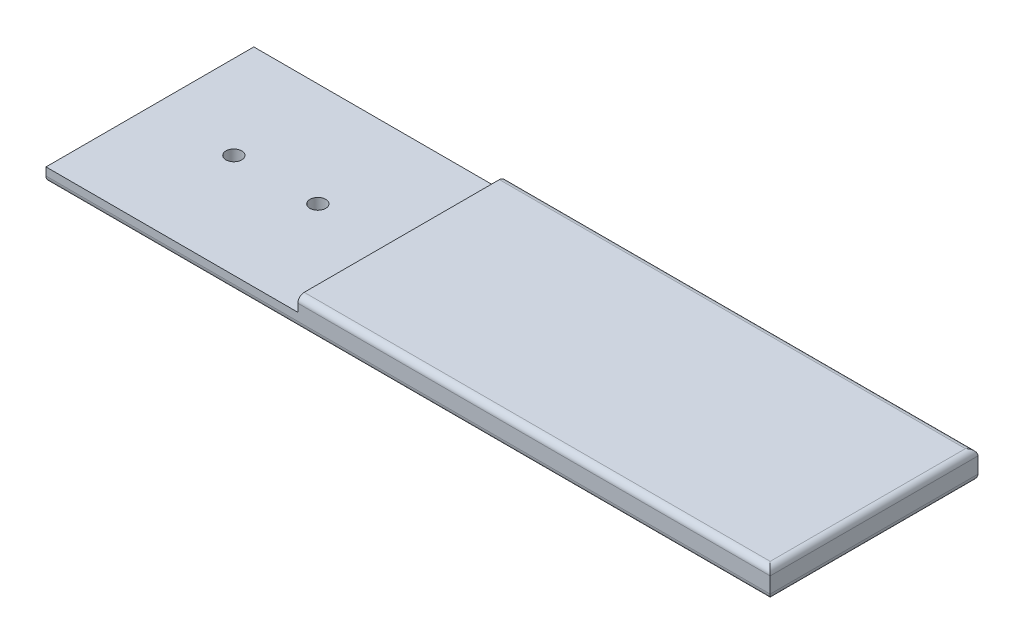
ISO-10303-21;
HEADER;
FILE_DESCRIPTION(('STEP AP214'),'2;1');
FILE_NAME('part.step','',(''),(''),'','','');
FILE_SCHEMA(('AUTOMOTIVE_DESIGN { 1 0 10303 214 1 1 1 1 }'));
ENDSEC;
DATA;
#1=APPLICATION_CONTEXT('core data for automotive mechanical design processes');
#2=APPLICATION_PROTOCOL_DEFINITION('international standard','automotive_design',2000,#1);
#3=PRODUCT_CONTEXT('',#1,'mechanical');
#4=PRODUCT('Part','Part','',(#3));
#5=PRODUCT_RELATED_PRODUCT_CATEGORY('part','',(#4));
#6=PRODUCT_DEFINITION_FORMATION('','',#4);
#7=PRODUCT_DEFINITION_CONTEXT('part definition',#1,'design');
#8=PRODUCT_DEFINITION('design','',#6,#7);
#9=PRODUCT_DEFINITION_SHAPE('','',#8);
#10=(LENGTH_UNIT() NAMED_UNIT(*) SI_UNIT(.MILLI.,.METRE.));
#11=(NAMED_UNIT(*) PLANE_ANGLE_UNIT() SI_UNIT($,.RADIAN.));
#12=(NAMED_UNIT(*) SI_UNIT($,.STERADIAN.) SOLID_ANGLE_UNIT());
#13=UNCERTAINTY_MEASURE_WITH_UNIT(LENGTH_MEASURE(1.E-05),#10,'distance_accuracy_value','');
#14=(GEOMETRIC_REPRESENTATION_CONTEXT(3) GLOBAL_UNCERTAINTY_ASSIGNED_CONTEXT((#13)) GLOBAL_UNIT_ASSIGNED_CONTEXT((#10,
#11,#12)) REPRESENTATION_CONTEXT('',''));
#15=CARTESIAN_POINT('',(0.,0.,0.));
#16=DIRECTION('',(0.,0.,1.));
#17=DIRECTION('',(1.,0.,0.));
#18=AXIS2_PLACEMENT_3D('',#15,#16,#17);
#19=CARTESIAN_POINT('',(0.,4.5,0.));
#20=DIRECTION('',(0.,-1.,0.));
#21=DIRECTION('',(0.,0.,-1.));
#22=AXIS2_PLACEMENT_3D('',#19,#20,#21);
#23=PLANE('',#22);
#24=CARTESIAN_POINT('',(-5.9231950844854,4.5,-12.4516129032258));
#25=DIRECTION('',(0.,-1.,0.));
#26=DIRECTION('',(0.,0.,-1.));
#27=AXIS2_PLACEMENT_3D('',#24,#25,#26);
#28=CIRCLE('',#27,2.5);
#29=CARTESIAN_POINT('',(-5.9231950844854,4.5,-14.9516129032258));
#30=VERTEX_POINT('',#29);
#31=EDGE_CURVE('E427',#30,#30,#28,.T.);
#32=ORIENTED_EDGE('',*,*,#31,.T.);
#33=EDGE_LOOP('',(#32));
#34=FACE_BOUND('',#33,.T.);
#35=CARTESIAN_POINT('',(20.7434715821813,4.5,-12.4516129032258));
#36=DIRECTION('',(0.,-1.,0.));
#37=DIRECTION('',(0.,0.,-1.));
#38=AXIS2_PLACEMENT_3D('',#35,#36,#37);
#39=CIRCLE('',#38,2.5);
#40=CARTESIAN_POINT('',(20.7434715821813,4.5,-14.9516129032258));
#41=VERTEX_POINT('',#40);
#42=EDGE_CURVE('E139',#41,#41,#39,.T.);
#43=ORIENTED_EDGE('',*,*,#42,.T.);
#44=EDGE_LOOP('',(#43));
#45=FACE_BOUND('',#44,.T.);
#46=DIRECTION('',(0.,0.,1.));
#47=VECTOR('',#46,1.);
#48=CARTESIAN_POINT('',(47.4101382488479,4.5,0.));
#49=LINE('',#48,#47);
#50=CARTESIAN_POINT('',(47.4101382488479,4.5,-45.4516129032258));
#51=VERTEX_POINT('',#50);
#52=CARTESIAN_POINT('',(47.4101382488479,4.5,20.5483870967742));
#53=VERTEX_POINT('',#52);
#54=EDGE_CURVE('E130',#51,#53,#49,.T.);
#55=ORIENTED_EDGE('',*,*,#54,.F.);
#56=DIRECTION('',(-1.,0.,0.));
#57=VECTOR('',#56,1.);
#58=CARTESIAN_POINT('',(-32.5898617511521,4.5,-45.4516129032258));
#59=LINE('',#58,#57);
#60=CARTESIAN_POINT('',(-32.5898617511521,4.5,-45.4516129032258));
#61=VERTEX_POINT('',#60);
#62=EDGE_CURVE('E135',#51,#61,#59,.T.);
#63=ORIENTED_EDGE('',*,*,#62,.T.);
#64=DIRECTION('',(0.,0.,1.));
#65=VECTOR('',#64,1.);
#66=CARTESIAN_POINT('',(-32.5898617511521,4.5,20.5483870967742));
#67=LINE('',#66,#65);
#68=CARTESIAN_POINT('',(-32.5898617511521,4.5,20.5483870967742));
#69=VERTEX_POINT('',#68);
#70=EDGE_CURVE('E133',#61,#69,#67,.T.);
#71=ORIENTED_EDGE('',*,*,#70,.T.);
#72=DIRECTION('',(1.,0.,0.));
#73=VECTOR('',#72,1.);
#74=CARTESIAN_POINT('',(-32.5898617511521,4.5,20.5483870967742));
#75=LINE('',#74,#73);
#76=EDGE_CURVE('E118',#69,#53,#75,.T.);
#77=ORIENTED_EDGE('',*,*,#76,.T.);
#78=EDGE_LOOP('',(#55,#63,#71,#77));
#79=FACE_BOUND('',#78,.T.);
#80=ADVANCED_FACE('F38',(#34,#45,#79),#23,.F.);
#81=CARTESIAN_POINT('',(-32.5898617511521,4.5,20.5483870967742));
#82=DIRECTION('',(1.,0.,0.));
#83=DIRECTION('',(0.,0.,-1.));
#84=AXIS2_PLACEMENT_3D('',#81,#82,#83);
#85=PLANE('',#84);
#86=DIRECTION('',(0.,-1.,0.));
#87=VECTOR('',#86,1.);
#88=CARTESIAN_POINT('',(-32.5898617511521,4.5,-45.4516129032258));
#89=LINE('',#88,#87);
#90=CARTESIAN_POINT('',(-32.5898617511521,2.,-45.4516129032258));
#91=VERTEX_POINT('',#90);
#92=EDGE_CURVE('E152',#61,#91,#89,.T.);
#93=ORIENTED_EDGE('',*,*,#92,.T.);
#94=CARTESIAN_POINT('',(-32.5898617511521,2.,-43.4516129032258));
#95=DIRECTION('',(1.,0.,0.));
#96=DIRECTION('',(0.,0.,-1.));
#97=AXIS2_PLACEMENT_3D('',#94,#95,#96);
#98=CIRCLE('',#97,2.);
#99=CARTESIAN_POINT('',(-32.5898617511521,0.,-43.4516129032258));
#100=VERTEX_POINT('',#99);
#101=EDGE_CURVE('E190',#91,#100,#98,.F.);
#102=ORIENTED_EDGE('',*,*,#101,.T.);
#103=DIRECTION('',(0.,0.,1.));
#104=VECTOR('',#103,1.);
#105=CARTESIAN_POINT('',(-32.5898617511521,0.,20.5483870967742));
#106=LINE('',#105,#104);
#107=CARTESIAN_POINT('',(-32.5898617511521,0.,18.5483870967742));
#108=VERTEX_POINT('',#107);
#109=EDGE_CURVE('E149',#100,#108,#106,.T.);
#110=ORIENTED_EDGE('',*,*,#109,.T.);
#111=CARTESIAN_POINT('',(-32.5898617511521,2.,18.5483870967742));
#112=DIRECTION('',(1.,0.,0.));
#113=DIRECTION('',(0.,0.,-1.));
#114=AXIS2_PLACEMENT_3D('',#111,#112,#113);
#115=CIRCLE('',#114,2.);
#116=CARTESIAN_POINT('',(-32.5898617511521,2.,20.5483870967742));
#117=VERTEX_POINT('',#116);
#118=EDGE_CURVE('E188',#108,#117,#115,.F.);
#119=ORIENTED_EDGE('',*,*,#118,.T.);
#120=DIRECTION('',(0.,-1.,0.));
#121=VECTOR('',#120,1.);
#122=CARTESIAN_POINT('',(-32.5898617511521,4.5,20.5483870967742));
#123=LINE('',#122,#121);
#124=EDGE_CURVE('E163',#69,#117,#123,.T.);
#125=ORIENTED_EDGE('',*,*,#124,.F.);
#126=ORIENTED_EDGE('',*,*,#70,.F.);
#127=EDGE_LOOP('',(#93,#102,#110,#119,#125,#126));
#128=FACE_BOUND('',#127,.T.);
#129=ADVANCED_FACE('F215',(#128),#85,.F.);
#130=CARTESIAN_POINT('',(-32.5898617511521,4.5,20.5483870967742));
#131=DIRECTION('',(0.,0.,-1.));
#132=DIRECTION('',(-1.,0.,0.));
#133=AXIS2_PLACEMENT_3D('',#130,#131,#132);
#134=PLANE('',#133);
#135=DIRECTION('',(0.,-1.,0.));
#136=VECTOR('',#135,1.);
#137=CARTESIAN_POINT('',(197.410138248848,4.5,20.5483870967742));
#138=LINE('',#137,#136);
#139=CARTESIAN_POINT('',(197.410138248848,7.,20.5483870967742));
#140=VERTEX_POINT('',#139);
#141=CARTESIAN_POINT('',(197.410138248848,2.,20.5483870967742));
#142=VERTEX_POINT('',#141);
#143=EDGE_CURVE('E160',#140,#142,#138,.T.);
#144=ORIENTED_EDGE('',*,*,#143,.F.);
#145=DIRECTION('',(1.,0.,0.));
#146=VECTOR('',#145,1.);
#147=CARTESIAN_POINT('',(47.4101382488479,7.,20.5483870967742));
#148=LINE('',#147,#146);
#149=CARTESIAN_POINT('',(47.4101382488479,7.,20.5483870967742));
#150=VERTEX_POINT('',#149);
#151=EDGE_CURVE('E121',#140,#150,#148,.F.);
#152=ORIENTED_EDGE('',*,*,#151,.T.);
#153=DIRECTION('',(0.,-1.,0.));
#154=VECTOR('',#153,1.);
#155=CARTESIAN_POINT('',(47.4101382488479,9.,20.5483870967742));
#156=LINE('',#155,#154);
#157=EDGE_CURVE('E113',#150,#53,#156,.T.);
#158=ORIENTED_EDGE('',*,*,#157,.T.);
#159=ORIENTED_EDGE('',*,*,#76,.F.);
#160=ORIENTED_EDGE('',*,*,#124,.T.);
#161=DIRECTION('',(1.,0.,0.));
#162=VECTOR('',#161,1.);
#163=CARTESIAN_POINT('',(197.410138248848,2.,20.5483870967742));
#164=LINE('',#163,#162);
#165=EDGE_CURVE('E172',#117,#142,#164,.T.);
#166=ORIENTED_EDGE('',*,*,#165,.T.);
#167=EDGE_LOOP('',(#144,#152,#158,#159,#160,#166));
#168=FACE_BOUND('',#167,.T.);
#169=ADVANCED_FACE('F116',(#168),#134,.F.);
#170=CARTESIAN_POINT('',(197.410138248848,4.5,20.5483870967742));
#171=DIRECTION('',(-1.,0.,0.));
#172=DIRECTION('',(0.,0.,1.));
#173=AXIS2_PLACEMENT_3D('',#170,#171,#172);
#174=PLANE('',#173);
#175=DIRECTION('',(0.,-1.,0.));
#176=VECTOR('',#175,1.);
#177=CARTESIAN_POINT('',(197.410138248848,4.5,-45.4516129032258));
#178=LINE('',#177,#176);
#179=CARTESIAN_POINT('',(197.410138248848,7.,-45.4516129032258));
#180=VERTEX_POINT('',#179);
#181=CARTESIAN_POINT('',(197.410138248848,2.,-45.4516129032258));
#182=VERTEX_POINT('',#181);
#183=EDGE_CURVE('E157',#180,#182,#178,.T.);
#184=ORIENTED_EDGE('',*,*,#183,.F.);
#185=DIRECTION('',(0.,0.,-1.));
#186=VECTOR('',#185,1.);
#187=CARTESIAN_POINT('',(197.410138248848,7.,20.5483870967742));
#188=LINE('',#187,#186);
#189=EDGE_CURVE('E181',#180,#140,#188,.F.);
#190=ORIENTED_EDGE('',*,*,#189,.T.);
#191=ORIENTED_EDGE('',*,*,#143,.T.);
#192=DIRECTION('',(0.,0.,-1.));
#193=VECTOR('',#192,1.);
#194=CARTESIAN_POINT('',(197.410138248848,2.,-45.4516129032258));
#195=LINE('',#194,#193);
#196=EDGE_CURVE('E179',#142,#182,#195,.T.);
#197=ORIENTED_EDGE('',*,*,#196,.T.);
#198=EDGE_LOOP('',(#184,#190,#191,#197));
#199=FACE_BOUND('',#198,.T.);
#200=ADVANCED_FACE('F224',(#199),#174,.F.);
#201=CARTESIAN_POINT('',(-32.5898617511521,4.5,-45.4516129032258));
#202=DIRECTION('',(0.,0.,1.));
#203=DIRECTION('',(1.,0.,0.));
#204=AXIS2_PLACEMENT_3D('',#201,#202,#203);
#205=PLANE('',#204);
#206=DIRECTION('',(0.,-1.,0.));
#207=VECTOR('',#206,1.);
#208=CARTESIAN_POINT('',(47.4101382488479,9.,-45.4516129032258));
#209=LINE('',#208,#207);
#210=CARTESIAN_POINT('',(47.4101382488479,7.,-45.4516129032258));
#211=VERTEX_POINT('',#210);
#212=EDGE_CURVE('E125',#211,#51,#209,.T.);
#213=ORIENTED_EDGE('',*,*,#212,.F.);
#214=DIRECTION('',(-1.,0.,0.));
#215=VECTOR('',#214,1.);
#216=CARTESIAN_POINT('',(197.410138248848,7.,-45.4516129032258));
#217=LINE('',#216,#215);
#218=EDGE_CURVE('E186',#211,#180,#217,.F.);
#219=ORIENTED_EDGE('',*,*,#218,.T.);
#220=ORIENTED_EDGE('',*,*,#183,.T.);
#221=DIRECTION('',(-1.,0.,0.));
#222=VECTOR('',#221,1.);
#223=CARTESIAN_POINT('',(-32.5898617511521,2.,-45.4516129032258));
#224=LINE('',#223,#222);
#225=EDGE_CURVE('E183',#182,#91,#224,.T.);
#226=ORIENTED_EDGE('',*,*,#225,.T.);
#227=ORIENTED_EDGE('',*,*,#92,.F.);
#228=ORIENTED_EDGE('',*,*,#62,.F.);
#229=EDGE_LOOP('',(#213,#219,#220,#226,#227,#228));
#230=FACE_BOUND('',#229,.T.);
#231=ADVANCED_FACE('F219',(#230),#205,.F.);
#232=CARTESIAN_POINT('',(0.,0.,0.));
#233=DIRECTION('',(0.,-1.,0.));
#234=DIRECTION('',(0.,0.,-1.));
#235=AXIS2_PLACEMENT_3D('',#232,#233,#234);
#236=PLANE('',#235);
#237=ORIENTED_EDGE('',*,*,#109,.F.);
#238=DIRECTION('',(-1.,0.,0.));
#239=VECTOR('',#238,1.);
#240=CARTESIAN_POINT('',(197.410138248848,0.,-43.4516129032258));
#241=LINE('',#240,#239);
#242=CARTESIAN_POINT('',(195.410138248848,0.,-43.4516129032258));
#243=VERTEX_POINT('',#242);
#244=EDGE_CURVE('E11',#100,#243,#241,.F.);
#245=ORIENTED_EDGE('',*,*,#244,.T.);
#246=DIRECTION('',(0.,0.,-1.));
#247=VECTOR('',#246,1.);
#248=CARTESIAN_POINT('',(195.410138248848,0.,20.5483870967742));
#249=LINE('',#248,#247);
#250=CARTESIAN_POINT('',(195.410138248848,0.,18.5483870967742));
#251=VERTEX_POINT('',#250);
#252=EDGE_CURVE('E54',#243,#251,#249,.F.);
#253=ORIENTED_EDGE('',*,*,#252,.T.);
#254=DIRECTION('',(1.,0.,0.));
#255=VECTOR('',#254,1.);
#256=CARTESIAN_POINT('',(-32.5898617511521,0.,18.5483870967742));
#257=LINE('',#256,#255);
#258=EDGE_CURVE('E47',#251,#108,#257,.F.);
#259=ORIENTED_EDGE('',*,*,#258,.T.);
#260=EDGE_LOOP('',(#237,#245,#253,#259));
#261=FACE_BOUND('',#260,.T.);
#262=CARTESIAN_POINT('',(-5.9231950844854,0.,-12.4516129032258));
#263=DIRECTION('',(0.,-1.,0.));
#264=DIRECTION('',(0.,0.,-1.));
#265=AXIS2_PLACEMENT_3D('',#262,#263,#264);
#266=CIRCLE('',#265,2.5);
#267=CARTESIAN_POINT('',(-5.9231950844854,0.,-14.9516129032258));
#268=VERTEX_POINT('',#267);
#269=EDGE_CURVE('E198',#268,#268,#266,.T.);
#270=ORIENTED_EDGE('',*,*,#269,.F.);
#271=EDGE_LOOP('',(#270));
#272=FACE_BOUND('',#271,.T.);
#273=CARTESIAN_POINT('',(20.7434715821813,0.,-12.4516129032258));
#274=DIRECTION('',(0.,-1.,0.));
#275=DIRECTION('',(0.,0.,-1.));
#276=AXIS2_PLACEMENT_3D('',#273,#274,#275);
#277=CIRCLE('',#276,2.5);
#278=CARTESIAN_POINT('',(20.7434715821813,0.,-14.9516129032258));
#279=VERTEX_POINT('',#278);
#280=EDGE_CURVE('E144',#279,#279,#277,.T.);
#281=ORIENTED_EDGE('',*,*,#280,.F.);
#282=EDGE_LOOP('',(#281));
#283=FACE_BOUND('',#282,.T.);
#284=ADVANCED_FACE('F212',(#261,#272,#283),#236,.T.);
#285=CARTESIAN_POINT('',(47.4101382488479,9.,0.));
#286=DIRECTION('',(1.,0.,0.));
#287=DIRECTION('',(0.,0.,-1.));
#288=AXIS2_PLACEMENT_3D('',#285,#286,#287);
#289=PLANE('',#288);
#290=ORIENTED_EDGE('',*,*,#157,.F.);
#291=CARTESIAN_POINT('',(47.4101382488479,7.,18.5483870967742));
#292=DIRECTION('',(1.,0.,0.));
#293=DIRECTION('',(0.,0.,-1.));
#294=AXIS2_PLACEMENT_3D('',#291,#292,#293);
#295=CIRCLE('',#294,2.);
#296=CARTESIAN_POINT('',(47.4101382488479,9.,18.5483870967742));
#297=VERTEX_POINT('',#296);
#298=EDGE_CURVE('E177',#150,#297,#295,.F.);
#299=ORIENTED_EDGE('',*,*,#298,.T.);
#300=DIRECTION('',(0.,0.,1.));
#301=VECTOR('',#300,1.);
#302=CARTESIAN_POINT('',(47.4101382488479,9.,0.));
#303=LINE('',#302,#301);
#304=CARTESIAN_POINT('',(47.4101382488479,9.,-43.4516129032258));
#305=VERTEX_POINT('',#304);
#306=EDGE_CURVE('E126',#305,#297,#303,.T.);
#307=ORIENTED_EDGE('',*,*,#306,.F.);
#308=CARTESIAN_POINT('',(47.4101382488479,7.,-43.4516129032258));
#309=DIRECTION('',(1.,0.,0.));
#310=DIRECTION('',(0.,0.,-1.));
#311=AXIS2_PLACEMENT_3D('',#308,#309,#310);
#312=CIRCLE('',#311,2.);
#313=EDGE_CURVE('E175',#305,#211,#312,.F.);
#314=ORIENTED_EDGE('',*,*,#313,.T.);
#315=ORIENTED_EDGE('',*,*,#212,.T.);
#316=ORIENTED_EDGE('',*,*,#54,.T.);
#317=EDGE_LOOP('',(#290,#299,#307,#314,#315,#316));
#318=FACE_BOUND('',#317,.T.);
#319=ADVANCED_FACE('F137',(#318),#289,.F.);
#320=CARTESIAN_POINT('',(0.,9.,0.));
#321=DIRECTION('',(0.,1.,0.));
#322=DIRECTION('',(0.,0.,1.));
#323=AXIS2_PLACEMENT_3D('',#320,#321,#322);
#324=PLANE('',#323);
#325=ORIENTED_EDGE('',*,*,#306,.T.);
#326=DIRECTION('',(1.,0.,0.));
#327=VECTOR('',#326,1.);
#328=CARTESIAN_POINT('',(197.410138248848,9.,18.5483870967742));
#329=LINE('',#328,#327);
#330=CARTESIAN_POINT('',(195.410138248848,9.,18.5483870967742));
#331=VERTEX_POINT('',#330);
#332=EDGE_CURVE('E169',#297,#331,#329,.T.);
#333=ORIENTED_EDGE('',*,*,#332,.T.);
#334=DIRECTION('',(0.,0.,-1.));
#335=VECTOR('',#334,1.);
#336=CARTESIAN_POINT('',(195.410138248848,9.,-45.4516129032258));
#337=LINE('',#336,#335);
#338=CARTESIAN_POINT('',(195.410138248848,9.,-43.4516129032258));
#339=VERTEX_POINT('',#338);
#340=EDGE_CURVE('E167',#331,#339,#337,.T.);
#341=ORIENTED_EDGE('',*,*,#340,.T.);
#342=DIRECTION('',(-1.,0.,0.));
#343=VECTOR('',#342,1.);
#344=CARTESIAN_POINT('',(47.4101382488479,9.,-43.4516129032258));
#345=LINE('',#344,#343);
#346=EDGE_CURVE('E164',#339,#305,#345,.T.);
#347=ORIENTED_EDGE('',*,*,#346,.T.);
#348=EDGE_LOOP('',(#325,#333,#341,#347));
#349=FACE_BOUND('',#348,.T.);
#350=ADVANCED_FACE('F239',(#349),#324,.T.);
#351=CARTESIAN_POINT('',(20.7434715821813,0.,-12.4516129032258));
#352=DIRECTION('',(0.,-1.,0.));
#353=DIRECTION('',(0.,0.,-1.));
#354=AXIS2_PLACEMENT_3D('',#351,#352,#353);
#355=CYLINDRICAL_SURFACE('',#354,2.5);
#356=ORIENTED_EDGE('',*,*,#280,.T.);
#357=EDGE_LOOP('',(#356));
#358=FACE_BOUND('',#357,.T.);
#359=ORIENTED_EDGE('',*,*,#42,.F.);
#360=EDGE_LOOP('',(#359));
#361=FACE_BOUND('',#360,.T.);
#362=ADVANCED_FACE('F241',(#358,#361),#355,.F.);
#363=CARTESIAN_POINT('',(-5.9231950844854,0.,-12.4516129032258));
#364=DIRECTION('',(0.,-1.,0.));
#365=DIRECTION('',(0.,0.,-1.));
#366=AXIS2_PLACEMENT_3D('',#363,#364,#365);
#367=CYLINDRICAL_SURFACE('',#366,2.5);
#368=ORIENTED_EDGE('',*,*,#269,.T.);
#369=EDGE_LOOP('',(#368));
#370=FACE_BOUND('',#369,.T.);
#371=ORIENTED_EDGE('',*,*,#31,.F.);
#372=EDGE_LOOP('',(#371));
#373=FACE_BOUND('',#372,.T.);
#374=ADVANCED_FACE('F247',(#370,#373),#367,.F.);
#375=CARTESIAN_POINT('',(0.,7.,-43.4516129032258));
#376=DIRECTION('',(1.,0.,0.));
#377=DIRECTION('',(0.,0.,-1.));
#378=AXIS2_PLACEMENT_3D('',#375,#376,#377);
#379=CYLINDRICAL_SURFACE('',#378,2.);
#380=ORIENTED_EDGE('',*,*,#313,.F.);
#381=ORIENTED_EDGE('',*,*,#346,.F.);
#382=CARTESIAN_POINT('',(195.410138248848,7.,-43.4516129032258));
#383=DIRECTION('',(0.707106781186547,0.,0.707106781186547));
#384=DIRECTION('',(0.707106781186547,0.,-0.707106781186547));
#385=AXIS2_PLACEMENT_3D('',#382,#383,#384);
#386=ELLIPSE('',#385,2.82842712474619,2.);
#387=EDGE_CURVE('E196',#180,#339,#386,.T.);
#388=ORIENTED_EDGE('',*,*,#387,.F.);
#389=ORIENTED_EDGE('',*,*,#218,.F.);
#390=EDGE_LOOP('',(#380,#381,#388,#389));
#391=FACE_BOUND('',#390,.T.);
#392=ADVANCED_FACE('F229',(#391),#379,.T.);
#393=CARTESIAN_POINT('',(195.410138248848,7.,0.));
#394=DIRECTION('',(0.,0.,1.));
#395=DIRECTION('',(1.,0.,0.));
#396=AXIS2_PLACEMENT_3D('',#393,#394,#395);
#397=CYLINDRICAL_SURFACE('',#396,2.);
#398=ORIENTED_EDGE('',*,*,#387,.T.);
#399=ORIENTED_EDGE('',*,*,#340,.F.);
#400=CARTESIAN_POINT('',(195.410138248848,7.,18.5483870967742));
#401=DIRECTION('',(-0.707106781186547,0.,0.707106781186547));
#402=DIRECTION('',(0.707106781186547,0.,0.707106781186547));
#403=AXIS2_PLACEMENT_3D('',#400,#401,#402);
#404=ELLIPSE('',#403,2.82842712474619,2.);
#405=EDGE_CURVE('E194',#140,#331,#404,.T.);
#406=ORIENTED_EDGE('',*,*,#405,.F.);
#407=ORIENTED_EDGE('',*,*,#189,.F.);
#408=EDGE_LOOP('',(#398,#399,#406,#407));
#409=FACE_BOUND('',#408,.T.);
#410=ADVANCED_FACE('F233',(#409),#397,.T.);
#411=CARTESIAN_POINT('',(0.,7.,18.5483870967742));
#412=DIRECTION('',(-1.,0.,0.));
#413=DIRECTION('',(0.,0.,1.));
#414=AXIS2_PLACEMENT_3D('',#411,#412,#413);
#415=CYLINDRICAL_SURFACE('',#414,2.);
#416=ORIENTED_EDGE('',*,*,#298,.F.);
#417=ORIENTED_EDGE('',*,*,#151,.F.);
#418=ORIENTED_EDGE('',*,*,#405,.T.);
#419=ORIENTED_EDGE('',*,*,#332,.F.);
#420=EDGE_LOOP('',(#416,#417,#418,#419));
#421=FACE_BOUND('',#420,.T.);
#422=ADVANCED_FACE('F236',(#421),#415,.T.);
#423=CARTESIAN_POINT('',(-32.5898617511521,2.,18.5483870967742));
#424=DIRECTION('',(-1.,0.,0.));
#425=DIRECTION('',(0.,0.,1.));
#426=AXIS2_PLACEMENT_3D('',#423,#424,#425);
#427=CYLINDRICAL_SURFACE('',#426,2.);
#428=ORIENTED_EDGE('',*,*,#118,.F.);
#429=ORIENTED_EDGE('',*,*,#258,.F.);
#430=CARTESIAN_POINT('',(195.410138248848,2.,18.5483870967742));
#431=DIRECTION('',(-0.707106781186547,0.,0.707106781186547));
#432=DIRECTION('',(0.707106781186547,0.,0.707106781186547));
#433=AXIS2_PLACEMENT_3D('',#430,#431,#432);
#434=ELLIPSE('',#433,2.82842712474619,2.);
#435=EDGE_CURVE('E42',#142,#251,#434,.F.);
#436=ORIENTED_EDGE('',*,*,#435,.F.);
#437=ORIENTED_EDGE('',*,*,#165,.F.);
#438=EDGE_LOOP('',(#428,#429,#436,#437));
#439=FACE_BOUND('',#438,.T.);
#440=ADVANCED_FACE('F40',(#439),#427,.T.);
#441=CARTESIAN_POINT('',(195.410138248848,2.,20.5483870967742));
#442=DIRECTION('',(0.,0.,1.));
#443=DIRECTION('',(1.,0.,0.));
#444=AXIS2_PLACEMENT_3D('',#441,#442,#443);
#445=CYLINDRICAL_SURFACE('',#444,2.);
#446=ORIENTED_EDGE('',*,*,#435,.T.);
#447=ORIENTED_EDGE('',*,*,#252,.F.);
#448=CARTESIAN_POINT('',(195.410138248848,2.,-43.4516129032258));
#449=DIRECTION('',(0.707106781186547,0.,0.707106781186547));
#450=DIRECTION('',(-0.707106781186547,0.,0.707106781186547));
#451=AXIS2_PLACEMENT_3D('',#448,#449,#450);
#452=ELLIPSE('',#451,2.82842712474619,2.);
#453=EDGE_CURVE('E199',#182,#243,#452,.F.);
#454=ORIENTED_EDGE('',*,*,#453,.F.);
#455=ORIENTED_EDGE('',*,*,#196,.F.);
#456=EDGE_LOOP('',(#446,#447,#454,#455));
#457=FACE_BOUND('',#456,.T.);
#458=ADVANCED_FACE('F208',(#457),#445,.T.);
#459=CARTESIAN_POINT('',(-32.5898617511521,2.,-43.4516129032258));
#460=DIRECTION('',(1.,0.,0.));
#461=DIRECTION('',(0.,0.,-1.));
#462=AXIS2_PLACEMENT_3D('',#459,#460,#461);
#463=CYLINDRICAL_SURFACE('',#462,2.);
#464=ORIENTED_EDGE('',*,*,#453,.T.);
#465=ORIENTED_EDGE('',*,*,#244,.F.);
#466=ORIENTED_EDGE('',*,*,#101,.F.);
#467=ORIENTED_EDGE('',*,*,#225,.F.);
#468=EDGE_LOOP('',(#464,#465,#466,#467));
#469=FACE_BOUND('',#468,.T.);
#470=ADVANCED_FACE('F217',(#469),#463,.T.);
#471=CLOSED_SHELL('',(#80,#129,#169,#200,#231,#284,#319,#350,#362,#374,#392,#410,#422,#440,#458,#470));
#472=MANIFOLD_SOLID_BREP('B2',#471);
#473=ADVANCED_BREP_SHAPE_REPRESENTATION('',(#18,#472),#14);
#474=SHAPE_DEFINITION_REPRESENTATION(#9,#473);
ENDSEC;
END-ISO-10303-21;
